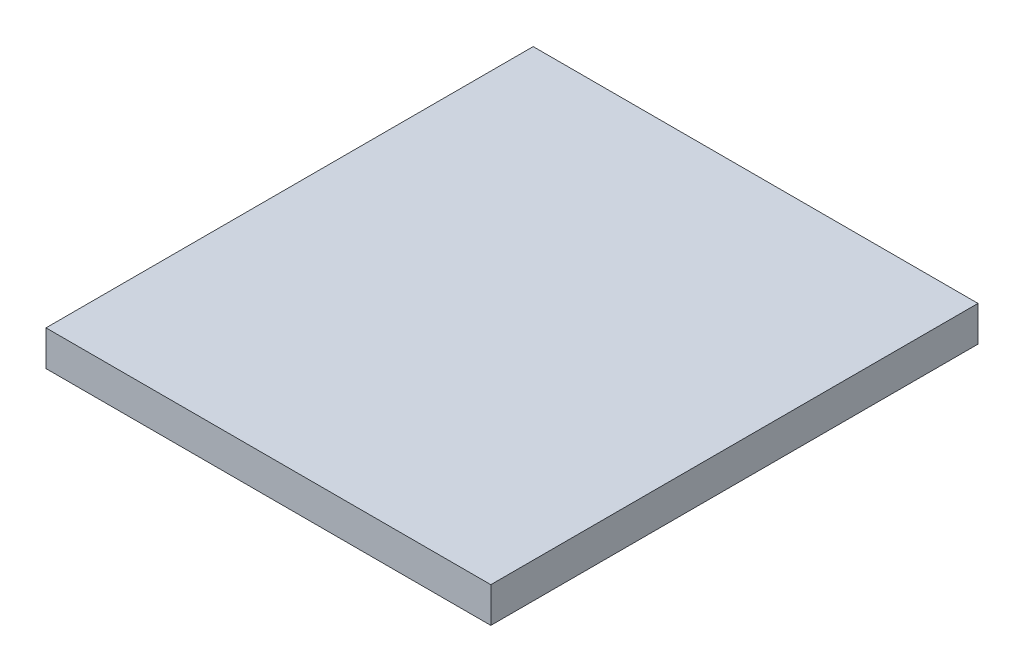
ISO-10303-21;
HEADER;
FILE_DESCRIPTION(('STEP AP214'),'2;1');
FILE_NAME('part.step','',(''),(''),'','','');
FILE_SCHEMA(('AUTOMOTIVE_DESIGN { 1 0 10303 214 1 1 1 1 }'));
ENDSEC;
DATA;
#1=APPLICATION_CONTEXT('core data for automotive mechanical design processes');
#2=APPLICATION_PROTOCOL_DEFINITION('international standard','automotive_design',2000,#1);
#3=PRODUCT_CONTEXT('',#1,'mechanical');
#4=PRODUCT('Part','Part','',(#3));
#5=PRODUCT_RELATED_PRODUCT_CATEGORY('part','',(#4));
#6=PRODUCT_DEFINITION_FORMATION('','',#4);
#7=PRODUCT_DEFINITION_CONTEXT('part definition',#1,'design');
#8=PRODUCT_DEFINITION('design','',#6,#7);
#9=PRODUCT_DEFINITION_SHAPE('','',#8);
#10=(LENGTH_UNIT() NAMED_UNIT(*) SI_UNIT(.MILLI.,.METRE.));
#11=(NAMED_UNIT(*) PLANE_ANGLE_UNIT() SI_UNIT($,.RADIAN.));
#12=(NAMED_UNIT(*) SI_UNIT($,.STERADIAN.) SOLID_ANGLE_UNIT());
#13=UNCERTAINTY_MEASURE_WITH_UNIT(LENGTH_MEASURE(1.E-05),#10,'distance_accuracy_value','');
#14=(GEOMETRIC_REPRESENTATION_CONTEXT(3) GLOBAL_UNCERTAINTY_ASSIGNED_CONTEXT((#13)) GLOBAL_UNIT_ASSIGNED_CONTEXT((#10,
#11,#12)) REPRESENTATION_CONTEXT('',''));
#15=CARTESIAN_POINT('',(0.,0.,0.));
#16=DIRECTION('',(0.,0.,1.));
#17=DIRECTION('',(1.,0.,0.));
#18=AXIS2_PLACEMENT_3D('',#15,#16,#17);
#19=CARTESIAN_POINT('',(31.5,5.,-34.5));
#20=DIRECTION('',(-1.,0.,0.));
#21=DIRECTION('',(0.,0.,1.));
#22=AXIS2_PLACEMENT_3D('',#19,#20,#21);
#23=PLANE('',#22);
#24=DIRECTION('',(0.,0.,-1.));
#25=VECTOR('',#24,1.);
#26=CARTESIAN_POINT('',(31.5,0.,-34.5));
#27=LINE('',#26,#25);
#28=CARTESIAN_POINT('',(31.5,0.,34.5));
#29=VERTEX_POINT('',#28);
#30=CARTESIAN_POINT('',(31.5,0.,-34.5));
#31=VERTEX_POINT('',#30);
#32=EDGE_CURVE('E96',#29,#31,#27,.T.);
#33=ORIENTED_EDGE('',*,*,#32,.T.);
#34=DIRECTION('',(0.,-1.,0.));
#35=VECTOR('',#34,1.);
#36=CARTESIAN_POINT('',(31.5,5.,-34.5));
#37=LINE('',#36,#35);
#38=CARTESIAN_POINT('',(31.5,5.,-34.5));
#39=VERTEX_POINT('',#38);
#40=EDGE_CURVE('E11',#39,#31,#37,.T.);
#41=ORIENTED_EDGE('',*,*,#40,.F.);
#42=DIRECTION('',(0.,0.,-1.));
#43=VECTOR('',#42,1.);
#44=CARTESIAN_POINT('',(31.5,5.,-34.5));
#45=LINE('',#44,#43);
#46=CARTESIAN_POINT('',(31.5,5.,34.5));
#47=VERTEX_POINT('',#46);
#48=EDGE_CURVE('E84',#47,#39,#45,.T.);
#49=ORIENTED_EDGE('',*,*,#48,.F.);
#50=DIRECTION('',(0.,-1.,0.));
#51=VECTOR('',#50,1.);
#52=CARTESIAN_POINT('',(31.5,5.,34.5));
#53=LINE('',#52,#51);
#54=EDGE_CURVE('E92',#47,#29,#53,.T.);
#55=ORIENTED_EDGE('',*,*,#54,.T.);
#56=EDGE_LOOP('',(#33,#41,#49,#55));
#57=FACE_BOUND('',#56,.T.);
#58=ADVANCED_FACE('F33',(#57),#23,.F.);
#59=CARTESIAN_POINT('',(-31.5,5.,-34.5));
#60=DIRECTION('',(0.,0.,1.));
#61=DIRECTION('',(1.,0.,0.));
#62=AXIS2_PLACEMENT_3D('',#59,#60,#61);
#63=PLANE('',#62);
#64=DIRECTION('',(-1.,0.,0.));
#65=VECTOR('',#64,1.);
#66=CARTESIAN_POINT('',(-31.5,0.,-34.5));
#67=LINE('',#66,#65);
#68=CARTESIAN_POINT('',(-31.5,0.,-34.5));
#69=VERTEX_POINT('',#68);
#70=EDGE_CURVE('E88',#31,#69,#67,.T.);
#71=ORIENTED_EDGE('',*,*,#70,.T.);
#72=DIRECTION('',(0.,-1.,0.));
#73=VECTOR('',#72,1.);
#74=CARTESIAN_POINT('',(-31.5,5.,-34.5));
#75=LINE('',#74,#73);
#76=CARTESIAN_POINT('',(-31.5,5.,-34.5));
#77=VERTEX_POINT('',#76);
#78=EDGE_CURVE('E41',#77,#69,#75,.T.);
#79=ORIENTED_EDGE('',*,*,#78,.F.);
#80=DIRECTION('',(-1.,0.,0.));
#81=VECTOR('',#80,1.);
#82=CARTESIAN_POINT('',(-31.5,5.,-34.5));
#83=LINE('',#82,#81);
#84=EDGE_CURVE('E79',#39,#77,#83,.T.);
#85=ORIENTED_EDGE('',*,*,#84,.F.);
#86=ORIENTED_EDGE('',*,*,#40,.T.);
#87=EDGE_LOOP('',(#71,#79,#85,#86));
#88=FACE_BOUND('',#87,.T.);
#89=ADVANCED_FACE('F87',(#88),#63,.F.);
#90=CARTESIAN_POINT('',(-31.5,5.,-34.5));
#91=DIRECTION('',(1.,0.,0.));
#92=DIRECTION('',(0.,0.,-1.));
#93=AXIS2_PLACEMENT_3D('',#90,#91,#92);
#94=PLANE('',#93);
#95=DIRECTION('',(0.,0.,1.));
#96=VECTOR('',#95,1.);
#97=CARTESIAN_POINT('',(-31.5,0.,-34.5));
#98=LINE('',#97,#96);
#99=CARTESIAN_POINT('',(-31.5,0.,34.5));
#100=VERTEX_POINT('',#99);
#101=EDGE_CURVE('E66',#69,#100,#98,.T.);
#102=ORIENTED_EDGE('',*,*,#101,.T.);
#103=DIRECTION('',(0.,-1.,0.));
#104=VECTOR('',#103,1.);
#105=CARTESIAN_POINT('',(-31.5,5.,34.5));
#106=LINE('',#105,#104);
#107=CARTESIAN_POINT('',(-31.5,5.,34.5));
#108=VERTEX_POINT('',#107);
#109=EDGE_CURVE('E89',#108,#100,#106,.T.);
#110=ORIENTED_EDGE('',*,*,#109,.F.);
#111=DIRECTION('',(0.,0.,1.));
#112=VECTOR('',#111,1.);
#113=CARTESIAN_POINT('',(-31.5,5.,-34.5));
#114=LINE('',#113,#112);
#115=EDGE_CURVE('E82',#77,#108,#114,.T.);
#116=ORIENTED_EDGE('',*,*,#115,.F.);
#117=ORIENTED_EDGE('',*,*,#78,.T.);
#118=EDGE_LOOP('',(#102,#110,#116,#117));
#119=FACE_BOUND('',#118,.T.);
#120=ADVANCED_FACE('F90',(#119),#94,.F.);
#121=CARTESIAN_POINT('',(-31.5,5.,34.5));
#122=DIRECTION('',(0.,0.,-1.));
#123=DIRECTION('',(-1.,0.,0.));
#124=AXIS2_PLACEMENT_3D('',#121,#122,#123);
#125=PLANE('',#124);
#126=DIRECTION('',(1.,0.,0.));
#127=VECTOR('',#126,1.);
#128=CARTESIAN_POINT('',(-31.5,0.,34.5));
#129=LINE('',#128,#127);
#130=EDGE_CURVE('E72',#100,#29,#129,.T.);
#131=ORIENTED_EDGE('',*,*,#130,.T.);
#132=ORIENTED_EDGE('',*,*,#54,.F.);
#133=DIRECTION('',(1.,0.,0.));
#134=VECTOR('',#133,1.);
#135=CARTESIAN_POINT('',(-31.5,5.,34.5));
#136=LINE('',#135,#134);
#137=EDGE_CURVE('E49',#108,#47,#136,.T.);
#138=ORIENTED_EDGE('',*,*,#137,.F.);
#139=ORIENTED_EDGE('',*,*,#109,.T.);
#140=EDGE_LOOP('',(#131,#132,#138,#139));
#141=FACE_BOUND('',#140,.T.);
#142=ADVANCED_FACE('F103',(#141),#125,.F.);
#143=CARTESIAN_POINT('',(0.,5.,0.));
#144=DIRECTION('',(0.,1.,0.));
#145=DIRECTION('',(0.,0.,1.));
#146=AXIS2_PLACEMENT_3D('',#143,#144,#145);
#147=PLANE('',#146);
#148=ORIENTED_EDGE('',*,*,#48,.T.);
#149=ORIENTED_EDGE('',*,*,#84,.T.);
#150=ORIENTED_EDGE('',*,*,#115,.T.);
#151=ORIENTED_EDGE('',*,*,#137,.T.);
#152=EDGE_LOOP('',(#148,#149,#150,#151));
#153=FACE_BOUND('',#152,.T.);
#154=ADVANCED_FACE('F80',(#153),#147,.T.);
#155=CARTESIAN_POINT('',(0.,0.,0.));
#156=DIRECTION('',(0.,1.,0.));
#157=DIRECTION('',(0.,0.,1.));
#158=AXIS2_PLACEMENT_3D('',#155,#156,#157);
#159=PLANE('',#158);
#160=ORIENTED_EDGE('',*,*,#32,.F.);
#161=ORIENTED_EDGE('',*,*,#130,.F.);
#162=ORIENTED_EDGE('',*,*,#101,.F.);
#163=ORIENTED_EDGE('',*,*,#70,.F.);
#164=EDGE_LOOP('',(#160,#161,#162,#163));
#165=FACE_BOUND('',#164,.T.);
#166=ADVANCED_FACE('F106',(#165),#159,.F.);
#167=CLOSED_SHELL('',(#58,#89,#120,#142,#154,#166));
#168=MANIFOLD_SOLID_BREP('B2',#167);
#169=ADVANCED_BREP_SHAPE_REPRESENTATION('',(#18,#168),#14);
#170=SHAPE_DEFINITION_REPRESENTATION(#9,#169);
ENDSEC;
END-ISO-10303-21;
